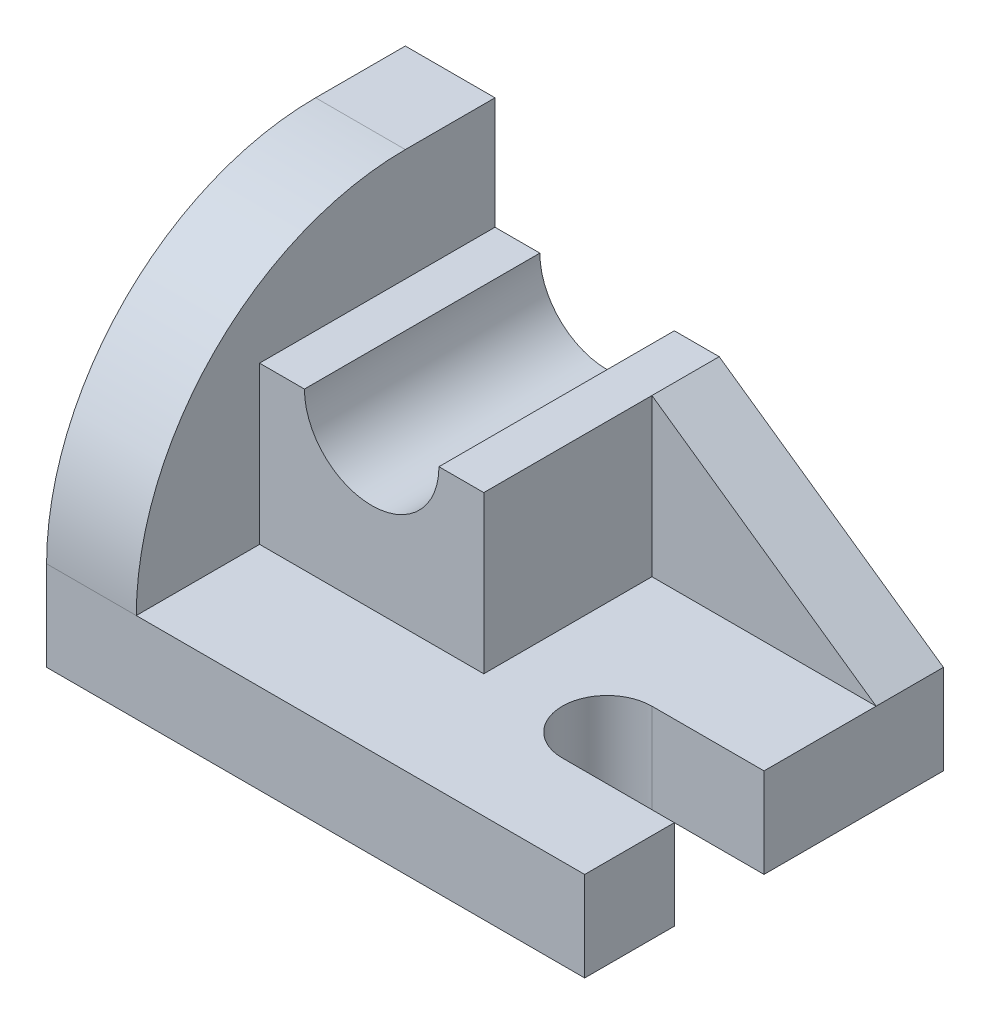
ISO-10303-21;
HEADER;
FILE_DESCRIPTION(('STEP AP214'),'2;1');
FILE_NAME('part.step','',(''),(''),'','','');
FILE_SCHEMA(('AUTOMOTIVE_DESIGN { 1 0 10303 214 1 1 1 1 }'));
ENDSEC;
DATA;
#1=APPLICATION_CONTEXT('core data for automotive mechanical design processes');
#2=APPLICATION_PROTOCOL_DEFINITION('international standard','automotive_design',2000,#1);
#3=PRODUCT_CONTEXT('',#1,'mechanical');
#4=PRODUCT('Part','Part','',(#3));
#5=PRODUCT_RELATED_PRODUCT_CATEGORY('part','',(#4));
#6=PRODUCT_DEFINITION_FORMATION('','',#4);
#7=PRODUCT_DEFINITION_CONTEXT('part definition',#1,'design');
#8=PRODUCT_DEFINITION('design','',#6,#7);
#9=PRODUCT_DEFINITION_SHAPE('','',#8);
#10=(LENGTH_UNIT() NAMED_UNIT(*) SI_UNIT(.MILLI.,.METRE.));
#11=(NAMED_UNIT(*) PLANE_ANGLE_UNIT() SI_UNIT($,.RADIAN.));
#12=(NAMED_UNIT(*) SI_UNIT($,.STERADIAN.) SOLID_ANGLE_UNIT());
#13=UNCERTAINTY_MEASURE_WITH_UNIT(LENGTH_MEASURE(1.E-05),#10,'distance_accuracy_value','');
#14=(GEOMETRIC_REPRESENTATION_CONTEXT(3) GLOBAL_UNCERTAINTY_ASSIGNED_CONTEXT((#13)) GLOBAL_UNIT_ASSIGNED_CONTEXT((#10,
#11,#12)) REPRESENTATION_CONTEXT('',''));
#15=CARTESIAN_POINT('',(0.,0.,0.));
#16=DIRECTION('',(0.,0.,1.));
#17=DIRECTION('',(1.,0.,0.));
#18=AXIS2_PLACEMENT_3D('',#15,#16,#17);
#19=CARTESIAN_POINT('',(0.,16.,0.));
#20=DIRECTION('',(0.,1.,0.));
#21=DIRECTION('',(0.,0.,1.));
#22=AXIS2_PLACEMENT_3D('',#19,#20,#21);
#23=PLANE('',#22);
#24=DIRECTION('',(0.,0.,-1.));
#25=VECTOR('',#24,1.);
#26=CARTESIAN_POINT('',(49.2427184466019,16.,-25.6310679611651));
#27=LINE('',#26,#25);
#28=CARTESIAN_POINT('',(49.2427184466019,16.,6.36893203883495));
#29=VERTEX_POINT('',#28);
#30=CARTESIAN_POINT('',(49.2427184466019,16.,-13.631067961165));
#31=VERTEX_POINT('',#30);
#32=EDGE_CURVE('E170',#29,#31,#27,.T.);
#33=ORIENTED_EDGE('',*,*,#32,.T.);
#34=DIRECTION('',(-1.,0.,0.));
#35=VECTOR('',#34,1.);
#36=CARTESIAN_POINT('',(0.,16.,-13.631067961165));
#37=LINE('',#36,#35);
#38=CARTESIAN_POINT('',(9.24271844660194,16.,-13.631067961165));
#39=VERTEX_POINT('',#38);
#40=EDGE_CURVE('E176',#31,#39,#37,.T.);
#41=ORIENTED_EDGE('',*,*,#40,.T.);
#42=DIRECTION('',(0.,0.,-1.));
#43=VECTOR('',#42,1.);
#44=CARTESIAN_POINT('',(9.24271844660194,16.,-25.6310679611651));
#45=LINE('',#44,#43);
#46=CARTESIAN_POINT('',(9.24271844660194,16.,16.368932038835));
#47=VERTEX_POINT('',#46);
#48=EDGE_CURVE('E241',#47,#39,#45,.T.);
#49=ORIENTED_EDGE('',*,*,#48,.F.);
#50=DIRECTION('',(1.,0.,0.));
#51=VECTOR('',#50,1.);
#52=CARTESIAN_POINT('',(-30.7572815533981,16.,16.368932038835));
#53=LINE('',#52,#51);
#54=CARTESIAN_POINT('',(-30.7572815533981,16.,16.368932038835));
#55=VERTEX_POINT('',#54);
#56=EDGE_CURVE('E234',#55,#47,#53,.T.);
#57=ORIENTED_EDGE('',*,*,#56,.F.);
#58=DIRECTION('',(0.,0.,-1.));
#59=VECTOR('',#58,1.);
#60=CARTESIAN_POINT('',(-30.7572815533981,16.,-25.6310679611651));
#61=LINE('',#60,#59);
#62=CARTESIAN_POINT('',(-30.7572815533981,16.,38.3689320388349));
#63=VERTEX_POINT('',#62);
#64=EDGE_CURVE('E275',#63,#55,#61,.T.);
#65=ORIENTED_EDGE('',*,*,#64,.F.);
#66=DIRECTION('',(1.,0.,0.));
#67=VECTOR('',#66,1.);
#68=CARTESIAN_POINT('',(-46.757281553398,16.,38.3689320388349));
#69=LINE('',#68,#67);
#70=CARTESIAN_POINT('',(49.2427184466019,16.,38.3689320388349));
#71=VERTEX_POINT('',#70);
#72=EDGE_CURVE('E189',#63,#71,#69,.T.);
#73=ORIENTED_EDGE('',*,*,#72,.T.);
#74=CARTESIAN_POINT('',(49.2427184466019,16.,22.3689320388349));
#75=VERTEX_POINT('',#74);
#76=EDGE_CURVE('E188',#71,#75,#27,.T.);
#77=ORIENTED_EDGE('',*,*,#76,.T.);
#78=DIRECTION('',(1.,0.,0.));
#79=VECTOR('',#78,1.);
#80=CARTESIAN_POINT('',(49.2427184466019,16.,22.3689320388349));
#81=LINE('',#80,#79);
#82=CARTESIAN_POINT('',(29.2427184466019,16.,22.368932038835));
#83=VERTEX_POINT('',#82);
#84=EDGE_CURVE('E260',#83,#75,#81,.T.);
#85=ORIENTED_EDGE('',*,*,#84,.F.);
#86=CARTESIAN_POINT('',(29.2427184466019,16.,14.368932038835));
#87=DIRECTION('',(0.,1.,0.));
#88=DIRECTION('',(0.,0.,1.));
#89=AXIS2_PLACEMENT_3D('',#86,#87,#88);
#90=CIRCLE('',#89,8.);
#91=CARTESIAN_POINT('',(29.2427184466019,16.,6.36893203883495));
#92=VERTEX_POINT('',#91);
#93=EDGE_CURVE('E268',#92,#83,#90,.T.);
#94=ORIENTED_EDGE('',*,*,#93,.F.);
#95=DIRECTION('',(-1.,0.,0.));
#96=VECTOR('',#95,1.);
#97=CARTESIAN_POINT('',(49.2427184466019,16.,6.36893203883495));
#98=LINE('',#97,#96);
#99=EDGE_CURVE('E187',#29,#92,#98,.T.);
#100=ORIENTED_EDGE('',*,*,#99,.F.);
#101=EDGE_LOOP('',(#33,#41,#49,#57,#65,#73,#77,#85,#94,#100));
#102=FACE_BOUND('',#101,.T.);
#103=ADVANCED_FACE('F36',(#102),#23,.T.);
#104=CARTESIAN_POINT('',(9.24271844660194,44.,-25.6310679611651));
#105=DIRECTION('',(-1.,0.,0.));
#106=DIRECTION('',(0.,0.,1.));
#107=AXIS2_PLACEMENT_3D('',#104,#105,#106);
#108=PLANE('',#107);
#109=DIRECTION('',(0.,-1.,0.));
#110=VECTOR('',#109,1.);
#111=CARTESIAN_POINT('',(9.24271844660194,44.,-13.631067961165));
#112=LINE('',#111,#110);
#113=CARTESIAN_POINT('',(9.24271844660194,44.,-13.631067961165));
#114=VERTEX_POINT('',#113);
#115=EDGE_CURVE('E178',#114,#39,#112,.T.);
#116=ORIENTED_EDGE('',*,*,#115,.F.);
#117=DIRECTION('',(0.,0.,-1.));
#118=VECTOR('',#117,1.);
#119=CARTESIAN_POINT('',(9.24271844660194,44.,-25.6310679611651));
#120=LINE('',#119,#118);
#121=CARTESIAN_POINT('',(9.24271844660194,44.,16.368932038835));
#122=VERTEX_POINT('',#121);
#123=EDGE_CURVE('E245',#122,#114,#120,.T.);
#124=ORIENTED_EDGE('',*,*,#123,.F.);
#125=DIRECTION('',(0.,-1.,0.));
#126=VECTOR('',#125,1.);
#127=CARTESIAN_POINT('',(9.24271844660194,44.,16.368932038835));
#128=LINE('',#127,#126);
#129=EDGE_CURVE('E249',#122,#47,#128,.T.);
#130=ORIENTED_EDGE('',*,*,#129,.T.);
#131=ORIENTED_EDGE('',*,*,#48,.T.);
#132=EDGE_LOOP('',(#116,#124,#130,#131));
#133=FACE_BOUND('',#132,.T.);
#134=ADVANCED_FACE('F304',(#133),#108,.F.);
#135=CARTESIAN_POINT('',(0.,44.,0.));
#136=DIRECTION('',(0.,1.,0.));
#137=DIRECTION('',(0.,0.,1.));
#138=AXIS2_PLACEMENT_3D('',#135,#136,#137);
#139=PLANE('',#138);
#140=DIRECTION('',(0.,0.,1.));
#141=VECTOR('',#140,1.);
#142=CARTESIAN_POINT('',(-22.7572815533981,44.,-25.6310679611651));
#143=LINE('',#142,#141);
#144=CARTESIAN_POINT('',(-22.7572815533981,44.,-25.6310679611651));
#145=VERTEX_POINT('',#144);
#146=CARTESIAN_POINT('',(-22.7572815533981,44.,16.368932038835));
#147=VERTEX_POINT('',#146);
#148=EDGE_CURVE('E11',#145,#147,#143,.T.);
#149=ORIENTED_EDGE('',*,*,#148,.F.);
#150=DIRECTION('',(-1.,0.,0.));
#151=VECTOR('',#150,1.);
#152=CARTESIAN_POINT('',(-30.7572815533981,44.,-25.6310679611651));
#153=LINE('',#152,#151);
#154=CARTESIAN_POINT('',(-30.7572815533981,44.,-25.6310679611651));
#155=VERTEX_POINT('',#154);
#156=EDGE_CURVE('E58',#145,#155,#153,.T.);
#157=ORIENTED_EDGE('',*,*,#156,.T.);
#158=DIRECTION('',(0.,0.,1.));
#159=VECTOR('',#158,1.);
#160=CARTESIAN_POINT('',(-30.7572815533981,44.,-25.6310679611651));
#161=LINE('',#160,#159);
#162=CARTESIAN_POINT('',(-30.7572815533981,44.,16.368932038835));
#163=VERTEX_POINT('',#162);
#164=EDGE_CURVE('E238',#155,#163,#161,.T.);
#165=ORIENTED_EDGE('',*,*,#164,.T.);
#166=DIRECTION('',(1.,0.,0.));
#167=VECTOR('',#166,1.);
#168=CARTESIAN_POINT('',(-30.7572815533981,44.,16.368932038835));
#169=LINE('',#168,#167);
#170=EDGE_CURVE('E242',#163,#147,#169,.T.);
#171=ORIENTED_EDGE('',*,*,#170,.T.);
#172=EDGE_LOOP('',(#149,#157,#165,#171));
#173=FACE_BOUND('',#172,.T.);
#174=ADVANCED_FACE('F296',(#173),#139,.T.);
#175=CARTESIAN_POINT('',(-30.7572815533981,64.,-25.6310679611651));
#176=DIRECTION('',(-1.,0.,0.));
#177=DIRECTION('',(0.,0.,1.));
#178=AXIS2_PLACEMENT_3D('',#175,#176,#177);
#179=PLANE('',#178);
#180=DIRECTION('',(0.,-1.,0.));
#181=VECTOR('',#180,1.);
#182=CARTESIAN_POINT('',(-30.7572815533981,44.,16.368932038835));
#183=LINE('',#182,#181);
#184=EDGE_CURVE('E254',#163,#55,#183,.T.);
#185=ORIENTED_EDGE('',*,*,#184,.F.);
#186=ORIENTED_EDGE('',*,*,#164,.F.);
#187=DIRECTION('',(0.,-1.,0.));
#188=VECTOR('',#187,1.);
#189=CARTESIAN_POINT('',(-30.7572815533981,64.,-25.6310679611651));
#190=LINE('',#189,#188);
#191=CARTESIAN_POINT('',(-30.7572815533981,64.,-25.6310679611651));
#192=VERTEX_POINT('',#191);
#193=EDGE_CURVE('E201',#192,#155,#190,.T.);
#194=ORIENTED_EDGE('',*,*,#193,.F.);
#195=DIRECTION('',(0.,0.,-1.));
#196=VECTOR('',#195,1.);
#197=CARTESIAN_POINT('',(-30.7572815533981,64.,-25.6310679611651));
#198=LINE('',#197,#196);
#199=CARTESIAN_POINT('',(-30.7572815533981,64.,-9.63106796116505));
#200=VERTEX_POINT('',#199);
#201=EDGE_CURVE('E284',#200,#192,#198,.T.);
#202=ORIENTED_EDGE('',*,*,#201,.F.);
#203=CARTESIAN_POINT('',(-30.7572815533981,16.,-9.63106796116505));
#204=DIRECTION('',(-1.,0.,0.));
#205=DIRECTION('',(0.,0.,1.));
#206=AXIS2_PLACEMENT_3D('',#203,#204,#205);
#207=CIRCLE('',#206,48.);
#208=EDGE_CURVE('E219',#200,#63,#207,.F.);
#209=ORIENTED_EDGE('',*,*,#208,.T.);
#210=ORIENTED_EDGE('',*,*,#64,.T.);
#211=EDGE_LOOP('',(#185,#186,#194,#202,#209,#210));
#212=FACE_BOUND('',#211,.T.);
#213=ADVANCED_FACE('F295',(#212),#179,.F.);
#214=CARTESIAN_POINT('',(49.2427184466019,16.,-25.6310679611651));
#215=DIRECTION('',(-1.,0.,0.));
#216=DIRECTION('',(0.,0.,1.));
#217=AXIS2_PLACEMENT_3D('',#214,#215,#216);
#218=PLANE('',#217);
#219=DIRECTION('',(0.,0.,-1.));
#220=VECTOR('',#219,1.);
#221=CARTESIAN_POINT('',(49.2427184466019,0.,-25.6310679611651));
#222=LINE('',#221,#220);
#223=CARTESIAN_POINT('',(49.2427184466019,0.,38.3689320388349));
#224=VERTEX_POINT('',#223);
#225=CARTESIAN_POINT('',(49.2427184466019,0.,22.3689320388349));
#226=VERTEX_POINT('',#225);
#227=EDGE_CURVE('E204',#224,#226,#222,.T.);
#228=ORIENTED_EDGE('',*,*,#227,.T.);
#229=DIRECTION('',(0.,1.,0.));
#230=VECTOR('',#229,1.);
#231=CARTESIAN_POINT('',(49.2427184466019,0.,22.3689320388349));
#232=LINE('',#231,#230);
#233=EDGE_CURVE('E272',#226,#75,#232,.T.);
#234=ORIENTED_EDGE('',*,*,#233,.T.);
#235=ORIENTED_EDGE('',*,*,#76,.F.);
#236=DIRECTION('',(0.,-1.,0.));
#237=VECTOR('',#236,1.);
#238=CARTESIAN_POINT('',(49.2427184466019,16.,38.3689320388349));
#239=LINE('',#238,#237);
#240=EDGE_CURVE('E211',#71,#224,#239,.T.);
#241=ORIENTED_EDGE('',*,*,#240,.T.);
#242=EDGE_LOOP('',(#228,#234,#235,#241));
#243=FACE_BOUND('',#242,.T.);
#244=ADVANCED_FACE('F331',(#243),#218,.F.);
#245=CARTESIAN_POINT('',(-46.7572815533981,16.,-25.6310679611651));
#246=DIRECTION('',(1.,0.,0.));
#247=DIRECTION('',(0.,0.,-1.));
#248=AXIS2_PLACEMENT_3D('',#245,#246,#247);
#249=PLANE('',#248);
#250=DIRECTION('',(0.,-1.,0.));
#251=VECTOR('',#250,1.);
#252=CARTESIAN_POINT('',(-46.757281553398,16.,38.3689320388349));
#253=LINE('',#252,#251);
#254=CARTESIAN_POINT('',(-46.757281553398,16.,38.3689320388349));
#255=VERTEX_POINT('',#254);
#256=CARTESIAN_POINT('',(-46.757281553398,0.,38.3689320388349));
#257=VERTEX_POINT('',#256);
#258=EDGE_CURVE('E214',#255,#257,#253,.T.);
#259=ORIENTED_EDGE('',*,*,#258,.F.);
#260=CARTESIAN_POINT('',(-46.7572815533981,16.,-9.63106796116505));
#261=DIRECTION('',(1.,0.,0.));
#262=DIRECTION('',(0.,0.,-1.));
#263=AXIS2_PLACEMENT_3D('',#260,#261,#262);
#264=CIRCLE('',#263,48.);
#265=CARTESIAN_POINT('',(-46.7572815533981,64.,-9.63106796116505));
#266=VERTEX_POINT('',#265);
#267=EDGE_CURVE('E223',#255,#266,#264,.F.);
#268=ORIENTED_EDGE('',*,*,#267,.T.);
#269=DIRECTION('',(0.,0.,1.));
#270=VECTOR('',#269,1.);
#271=CARTESIAN_POINT('',(-46.7572815533981,64.,-25.6310679611651));
#272=LINE('',#271,#270);
#273=CARTESIAN_POINT('',(-46.7572815533981,64.,-25.6310679611651));
#274=VERTEX_POINT('',#273);
#275=EDGE_CURVE('E281',#274,#266,#272,.T.);
#276=ORIENTED_EDGE('',*,*,#275,.F.);
#277=DIRECTION('',(0.,-1.,0.));
#278=VECTOR('',#277,1.);
#279=CARTESIAN_POINT('',(-46.7572815533981,16.,-25.6310679611651));
#280=LINE('',#279,#278);
#281=CARTESIAN_POINT('',(-46.7572815533981,0.,-25.6310679611651));
#282=VERTEX_POINT('',#281);
#283=EDGE_CURVE('E192',#274,#282,#280,.T.);
#284=ORIENTED_EDGE('',*,*,#283,.T.);
#285=DIRECTION('',(0.,0.,1.));
#286=VECTOR('',#285,1.);
#287=CARTESIAN_POINT('',(-46.7572815533981,0.,-25.6310679611651));
#288=LINE('',#287,#286);
#289=EDGE_CURVE('E197',#282,#257,#288,.T.);
#290=ORIENTED_EDGE('',*,*,#289,.T.);
#291=EDGE_LOOP('',(#259,#268,#276,#284,#290));
#292=FACE_BOUND('',#291,.T.);
#293=ADVANCED_FACE('F316',(#292),#249,.F.);
#294=CARTESIAN_POINT('',(-46.757281553398,16.,38.3689320388349));
#295=DIRECTION('',(0.,0.,-1.));
#296=DIRECTION('',(-1.,0.,0.));
#297=AXIS2_PLACEMENT_3D('',#294,#295,#296);
#298=PLANE('',#297);
#299=ORIENTED_EDGE('',*,*,#72,.F.);
#300=DIRECTION('',(1.,0.,0.));
#301=VECTOR('',#300,1.);
#302=CARTESIAN_POINT('',(-46.7572815533981,16.,38.3689320388349));
#303=LINE('',#302,#301);
#304=EDGE_CURVE('E221',#63,#255,#303,.F.);
#305=ORIENTED_EDGE('',*,*,#304,.T.);
#306=ORIENTED_EDGE('',*,*,#258,.T.);
#307=DIRECTION('',(1.,0.,0.));
#308=VECTOR('',#307,1.);
#309=CARTESIAN_POINT('',(-46.757281553398,0.,38.3689320388349));
#310=LINE('',#309,#308);
#311=EDGE_CURVE('E200',#257,#224,#310,.T.);
#312=ORIENTED_EDGE('',*,*,#311,.T.);
#313=ORIENTED_EDGE('',*,*,#240,.F.);
#314=EDGE_LOOP('',(#299,#305,#306,#312,#313));
#315=FACE_BOUND('',#314,.T.);
#316=ADVANCED_FACE('F328',(#315),#298,.F.);
#317=DIRECTION('',(0.,-1.,0.));
#318=VECTOR('',#317,1.);
#319=CARTESIAN_POINT('',(49.2427184466019,16.,-25.6310679611651));
#320=LINE('',#319,#318);
#321=CARTESIAN_POINT('',(49.2427184466019,16.,-25.6310679611651));
#322=VERTEX_POINT('',#321);
#323=CARTESIAN_POINT('',(49.2427184466019,0.,-25.6310679611651));
#324=VERTEX_POINT('',#323);
#325=EDGE_CURVE('E172',#322,#324,#320,.T.);
#326=ORIENTED_EDGE('',*,*,#325,.F.);
#327=DIRECTION('',(0.,0.,1.));
#328=VECTOR('',#327,1.);
#329=CARTESIAN_POINT('',(49.2427184466019,16.,-57.631067961165));
#330=LINE('',#329,#328);
#331=EDGE_CURVE('E156',#322,#31,#330,.T.);
#332=ORIENTED_EDGE('',*,*,#331,.T.);
#333=ORIENTED_EDGE('',*,*,#32,.F.);
#334=DIRECTION('',(0.,1.,0.));
#335=VECTOR('',#334,1.);
#336=CARTESIAN_POINT('',(49.2427184466019,0.,6.36893203883495));
#337=LINE('',#336,#335);
#338=CARTESIAN_POINT('',(49.2427184466019,0.,6.36893203883495));
#339=VERTEX_POINT('',#338);
#340=EDGE_CURVE('E266',#339,#29,#337,.T.);
#341=ORIENTED_EDGE('',*,*,#340,.F.);
#342=EDGE_CURVE('E203',#339,#324,#222,.T.);
#343=ORIENTED_EDGE('',*,*,#342,.T.);
#344=EDGE_LOOP('',(#326,#332,#333,#341,#343));
#345=FACE_BOUND('',#344,.T.);
#346=ADVANCED_FACE('F167',(#345),#218,.F.);
#347=CARTESIAN_POINT('',(-46.7572815533981,16.,-25.6310679611651));
#348=DIRECTION('',(0.,0.,1.));
#349=DIRECTION('',(1.,0.,0.));
#350=AXIS2_PLACEMENT_3D('',#347,#348,#349);
#351=PLANE('',#350);
#352=CARTESIAN_POINT('',(9.24271844660194,44.,-25.6310679611651));
#353=VERTEX_POINT('',#352);
#354=CARTESIAN_POINT('',(1.24271844660194,44.,-25.6310679611651));
#355=VERTEX_POINT('',#354);
#356=EDGE_CURVE('E231',#353,#355,#153,.T.);
#357=ORIENTED_EDGE('',*,*,#356,.F.);
#358=DIRECTION('',(0.81923192051904,-0.573462344363328,0.));
#359=VECTOR('',#358,1.);
#360=CARTESIAN_POINT('',(-15.1868117547403,61.1006711409396,-25.6310679611651));
#361=LINE('',#360,#359);
#362=EDGE_CURVE('E173',#353,#322,#361,.T.);
#363=ORIENTED_EDGE('',*,*,#362,.T.);
#364=ORIENTED_EDGE('',*,*,#325,.T.);
#365=DIRECTION('',(-1.,0.,0.));
#366=VECTOR('',#365,1.);
#367=CARTESIAN_POINT('',(-46.7572815533981,0.,-25.6310679611651));
#368=LINE('',#367,#366);
#369=EDGE_CURVE('E193',#324,#282,#368,.T.);
#370=ORIENTED_EDGE('',*,*,#369,.T.);
#371=ORIENTED_EDGE('',*,*,#283,.F.);
#372=DIRECTION('',(-1.,0.,0.));
#373=VECTOR('',#372,1.);
#374=CARTESIAN_POINT('',(-46.7572815533981,64.,-25.6310679611651));
#375=LINE('',#374,#373);
#376=EDGE_CURVE('E286',#192,#274,#375,.T.);
#377=ORIENTED_EDGE('',*,*,#376,.F.);
#378=ORIENTED_EDGE('',*,*,#193,.T.);
#379=ORIENTED_EDGE('',*,*,#156,.F.);
#380=CARTESIAN_POINT('',(-10.7572815533981,44.,-25.6310679611651));
#381=DIRECTION('',(0.,0.,1.));
#382=DIRECTION('',(1.,0.,0.));
#383=AXIS2_PLACEMENT_3D('',#380,#381,#382);
#384=CIRCLE('',#383,12.);
#385=EDGE_CURVE('E182',#145,#355,#384,.T.);
#386=ORIENTED_EDGE('',*,*,#385,.T.);
#387=EDGE_LOOP('',(#357,#363,#364,#370,#371,#377,#378,#379,#386));
#388=FACE_BOUND('',#387,.T.);
#389=ADVANCED_FACE('F230',(#388),#351,.F.);
#390=CARTESIAN_POINT('',(0.,0.,0.));
#391=DIRECTION('',(0.,1.,0.));
#392=DIRECTION('',(0.,0.,1.));
#393=AXIS2_PLACEMENT_3D('',#390,#391,#392);
#394=PLANE('',#393);
#395=ORIENTED_EDGE('',*,*,#289,.F.);
#396=ORIENTED_EDGE('',*,*,#369,.F.);
#397=ORIENTED_EDGE('',*,*,#342,.F.);
#398=DIRECTION('',(-1.,0.,0.));
#399=VECTOR('',#398,1.);
#400=CARTESIAN_POINT('',(49.2427184466019,0.,6.36893203883495));
#401=LINE('',#400,#399);
#402=CARTESIAN_POINT('',(29.2427184466019,0.,6.36893203883495));
#403=VERTEX_POINT('',#402);
#404=EDGE_CURVE('E256',#339,#403,#401,.T.);
#405=ORIENTED_EDGE('',*,*,#404,.T.);
#406=CARTESIAN_POINT('',(29.2427184466019,0.,14.368932038835));
#407=DIRECTION('',(0.,1.,0.));
#408=DIRECTION('',(0.,0.,1.));
#409=AXIS2_PLACEMENT_3D('',#406,#407,#408);
#410=CIRCLE('',#409,8.);
#411=CARTESIAN_POINT('',(29.2427184466019,0.,22.368932038835));
#412=VERTEX_POINT('',#411);
#413=EDGE_CURVE('E259',#403,#412,#410,.T.);
#414=ORIENTED_EDGE('',*,*,#413,.T.);
#415=DIRECTION('',(1.,0.,0.));
#416=VECTOR('',#415,1.);
#417=CARTESIAN_POINT('',(49.2427184466019,0.,22.3689320388349));
#418=LINE('',#417,#416);
#419=EDGE_CURVE('E263',#412,#226,#418,.T.);
#420=ORIENTED_EDGE('',*,*,#419,.T.);
#421=ORIENTED_EDGE('',*,*,#227,.F.);
#422=ORIENTED_EDGE('',*,*,#311,.F.);
#423=EDGE_LOOP('',(#395,#396,#397,#405,#414,#420,#421,#422));
#424=FACE_BOUND('',#423,.T.);
#425=ADVANCED_FACE('F311',(#424),#394,.F.);
#426=CARTESIAN_POINT('',(0.,64.,0.));
#427=DIRECTION('',(0.,1.,0.));
#428=DIRECTION('',(0.,0.,1.));
#429=AXIS2_PLACEMENT_3D('',#426,#427,#428);
#430=PLANE('',#429);
#431=ORIENTED_EDGE('',*,*,#275,.T.);
#432=DIRECTION('',(1.,0.,0.));
#433=VECTOR('',#432,1.);
#434=CARTESIAN_POINT('',(-30.757281553398,64.,-9.63106796116505));
#435=LINE('',#434,#433);
#436=EDGE_CURVE('E216',#266,#200,#435,.T.);
#437=ORIENTED_EDGE('',*,*,#436,.T.);
#438=ORIENTED_EDGE('',*,*,#201,.T.);
#439=ORIENTED_EDGE('',*,*,#376,.T.);
#440=EDGE_LOOP('',(#431,#437,#438,#439));
#441=FACE_BOUND('',#440,.T.);
#442=ADVANCED_FACE('F320',(#441),#430,.T.);
#443=CARTESIAN_POINT('',(0.,16.,-9.63106796116505));
#444=DIRECTION('',(-1.,0.,0.));
#445=DIRECTION('',(0.,0.,1.));
#446=AXIS2_PLACEMENT_3D('',#443,#444,#445);
#447=CYLINDRICAL_SURFACE('',#446,48.);
#448=ORIENTED_EDGE('',*,*,#267,.F.);
#449=ORIENTED_EDGE('',*,*,#304,.F.);
#450=ORIENTED_EDGE('',*,*,#208,.F.);
#451=ORIENTED_EDGE('',*,*,#436,.F.);
#452=EDGE_LOOP('',(#448,#449,#450,#451));
#453=FACE_BOUND('',#452,.T.);
#454=ADVANCED_FACE('F38',(#453),#447,.T.);
#455=CARTESIAN_POINT('',(49.2427184466019,0.,22.3689320388349));
#456=DIRECTION('',(0.,0.,1.));
#457=DIRECTION('',(1.,0.,0.));
#458=AXIS2_PLACEMENT_3D('',#455,#456,#457);
#459=PLANE('',#458);
#460=ORIENTED_EDGE('',*,*,#84,.T.);
#461=ORIENTED_EDGE('',*,*,#233,.F.);
#462=ORIENTED_EDGE('',*,*,#419,.F.);
#463=DIRECTION('',(0.,1.,0.));
#464=VECTOR('',#463,1.);
#465=CARTESIAN_POINT('',(29.2427184466019,0.,22.368932038835));
#466=LINE('',#465,#464);
#467=EDGE_CURVE('E276',#412,#83,#466,.T.);
#468=ORIENTED_EDGE('',*,*,#467,.T.);
#469=EDGE_LOOP('',(#460,#461,#462,#468));
#470=FACE_BOUND('',#469,.T.);
#471=ADVANCED_FACE('F334',(#470),#459,.F.);
#472=CARTESIAN_POINT('',(29.2427184466019,0.,14.368932038835));
#473=DIRECTION('',(0.,1.,0.));
#474=DIRECTION('',(0.,0.,1.));
#475=AXIS2_PLACEMENT_3D('',#472,#473,#474);
#476=CYLINDRICAL_SURFACE('',#475,8.);
#477=ORIENTED_EDGE('',*,*,#93,.T.);
#478=ORIENTED_EDGE('',*,*,#467,.F.);
#479=ORIENTED_EDGE('',*,*,#413,.F.);
#480=DIRECTION('',(0.,1.,0.));
#481=VECTOR('',#480,1.);
#482=CARTESIAN_POINT('',(29.2427184466019,0.,6.36893203883495));
#483=LINE('',#482,#481);
#484=EDGE_CURVE('E278',#403,#92,#483,.T.);
#485=ORIENTED_EDGE('',*,*,#484,.T.);
#486=EDGE_LOOP('',(#477,#478,#479,#485));
#487=FACE_BOUND('',#486,.T.);
#488=ADVANCED_FACE('F337',(#487),#476,.F.);
#489=CARTESIAN_POINT('',(49.2427184466019,0.,6.36893203883495));
#490=DIRECTION('',(0.,0.,-1.));
#491=DIRECTION('',(-1.,0.,0.));
#492=AXIS2_PLACEMENT_3D('',#489,#490,#491);
#493=PLANE('',#492);
#494=ORIENTED_EDGE('',*,*,#99,.T.);
#495=ORIENTED_EDGE('',*,*,#484,.F.);
#496=ORIENTED_EDGE('',*,*,#404,.F.);
#497=ORIENTED_EDGE('',*,*,#340,.T.);
#498=EDGE_LOOP('',(#494,#495,#496,#497));
#499=FACE_BOUND('',#498,.T.);
#500=ADVANCED_FACE('F340',(#499),#493,.F.);
#501=CARTESIAN_POINT('',(-30.7572815533981,44.,16.368932038835));
#502=DIRECTION('',(0.,0.,-1.));
#503=DIRECTION('',(-1.,0.,0.));
#504=AXIS2_PLACEMENT_3D('',#501,#502,#503);
#505=PLANE('',#504);
#506=CARTESIAN_POINT('',(1.24271844660194,44.,16.368932038835));
#507=VERTEX_POINT('',#506);
#508=EDGE_CURVE('E240',#507,#122,#169,.T.);
#509=ORIENTED_EDGE('',*,*,#508,.F.);
#510=CARTESIAN_POINT('',(-10.7572815533981,44.,16.368932038835));
#511=DIRECTION('',(0.,0.,-1.));
#512=DIRECTION('',(-1.,0.,0.));
#513=AXIS2_PLACEMENT_3D('',#510,#511,#512);
#514=CIRCLE('',#513,12.);
#515=EDGE_CURVE('E50',#507,#147,#514,.T.);
#516=ORIENTED_EDGE('',*,*,#515,.T.);
#517=ORIENTED_EDGE('',*,*,#170,.F.);
#518=ORIENTED_EDGE('',*,*,#184,.T.);
#519=ORIENTED_EDGE('',*,*,#56,.T.);
#520=ORIENTED_EDGE('',*,*,#129,.F.);
#521=EDGE_LOOP('',(#509,#516,#517,#518,#519,#520));
#522=FACE_BOUND('',#521,.T.);
#523=ADVANCED_FACE('F298',(#522),#505,.F.);
#524=DIRECTION('',(0.,0.,1.));
#525=VECTOR('',#524,1.);
#526=CARTESIAN_POINT('',(9.24271844660194,44.,-57.631067961165));
#527=LINE('',#526,#525);
#528=EDGE_CURVE('E159',#353,#114,#527,.T.);
#529=ORIENTED_EDGE('',*,*,#528,.F.);
#530=ORIENTED_EDGE('',*,*,#356,.T.);
#531=DIRECTION('',(0.,0.,1.));
#532=VECTOR('',#531,1.);
#533=CARTESIAN_POINT('',(1.24271844660194,44.,-25.6310679611651));
#534=LINE('',#533,#532);
#535=EDGE_CURVE('E44',#507,#355,#534,.F.);
#536=ORIENTED_EDGE('',*,*,#535,.F.);
#537=ORIENTED_EDGE('',*,*,#508,.T.);
#538=ORIENTED_EDGE('',*,*,#123,.T.);
#539=EDGE_LOOP('',(#529,#530,#536,#537,#538));
#540=FACE_BOUND('',#539,.T.);
#541=ADVANCED_FACE('F302',(#540),#139,.T.);
#542=CARTESIAN_POINT('',(-10.7572815533981,44.,-25.6310679611651));
#543=DIRECTION('',(0.,0.,1.));
#544=DIRECTION('',(1.,0.,0.));
#545=AXIS2_PLACEMENT_3D('',#542,#543,#544);
#546=CYLINDRICAL_SURFACE('',#545,12.);
#547=ORIENTED_EDGE('',*,*,#148,.T.);
#548=ORIENTED_EDGE('',*,*,#515,.F.);
#549=ORIENTED_EDGE('',*,*,#535,.T.);
#550=ORIENTED_EDGE('',*,*,#385,.F.);
#551=EDGE_LOOP('',(#547,#548,#549,#550));
#552=FACE_BOUND('',#551,.T.);
#553=ADVANCED_FACE('F225',(#552),#546,.F.);
#554=CARTESIAN_POINT('',(49.2427184466019,44.,-13.6310679611651));
#555=DIRECTION('',(0.,0.,-1.));
#556=DIRECTION('',(-1.,0.,0.));
#557=AXIS2_PLACEMENT_3D('',#554,#555,#556);
#558=PLANE('',#557);
#559=ORIENTED_EDGE('',*,*,#40,.F.);
#560=DIRECTION('',(0.81923192051904,-0.573462344363328,0.));
#561=VECTOR('',#560,1.);
#562=CARTESIAN_POINT('',(9.24271844660194,44.,-13.631067961165));
#563=LINE('',#562,#561);
#564=EDGE_CURVE('E153',#114,#31,#563,.T.);
#565=ORIENTED_EDGE('',*,*,#564,.F.);
#566=ORIENTED_EDGE('',*,*,#115,.T.);
#567=EDGE_LOOP('',(#559,#565,#566));
#568=FACE_BOUND('',#567,.T.);
#569=ADVANCED_FACE('F177',(#568),#558,.F.);
#570=CARTESIAN_POINT('',(9.24271844660194,44.,-57.631067961165));
#571=DIRECTION('',(-0.573462344363328,-0.81923192051904,0.));
#572=DIRECTION('',(0.81923192051904,-0.573462344363328,0.));
#573=AXIS2_PLACEMENT_3D('',#570,#571,#572);
#574=PLANE('',#573);
#575=ORIENTED_EDGE('',*,*,#528,.T.);
#576=ORIENTED_EDGE('',*,*,#564,.T.);
#577=ORIENTED_EDGE('',*,*,#331,.F.);
#578=ORIENTED_EDGE('',*,*,#362,.F.);
#579=EDGE_LOOP('',(#575,#576,#577,#578));
#580=FACE_BOUND('',#579,.T.);
#581=ADVANCED_FACE('F155',(#580),#574,.F.);
#582=CLOSED_SHELL('',(#103,#134,#174,#213,#244,#293,#316,#346,#389,#425,#442,#454,#471,#488,
#500,#523,#541,#553,#569,#581));
#583=MANIFOLD_SOLID_BREP('B2',#582);
#584=ADVANCED_BREP_SHAPE_REPRESENTATION('',(#18,#583),#14);
#585=SHAPE_DEFINITION_REPRESENTATION(#9,#584);
ENDSEC;
END-ISO-10303-21;
